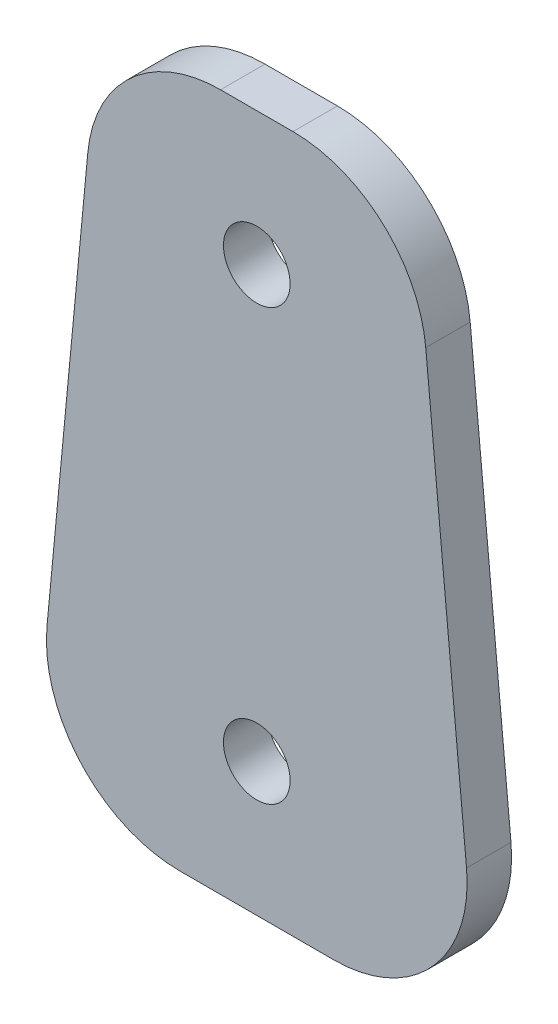
ISO-10303-21;
HEADER;
FILE_DESCRIPTION(('STEP AP214'),'2;1');
FILE_NAME('part.step','',(''),(''),'','','');
FILE_SCHEMA(('AUTOMOTIVE_DESIGN { 1 0 10303 214 1 1 1 1 }'));
ENDSEC;
DATA;
#1=APPLICATION_CONTEXT('core data for automotive mechanical design processes');
#2=APPLICATION_PROTOCOL_DEFINITION('international standard','automotive_design',2000,#1);
#3=PRODUCT_CONTEXT('',#1,'mechanical');
#4=PRODUCT('Part','Part','',(#3));
#5=PRODUCT_RELATED_PRODUCT_CATEGORY('part','',(#4));
#6=PRODUCT_DEFINITION_FORMATION('','',#4);
#7=PRODUCT_DEFINITION_CONTEXT('part definition',#1,'design');
#8=PRODUCT_DEFINITION('design','',#6,#7);
#9=PRODUCT_DEFINITION_SHAPE('','',#8);
#10=(LENGTH_UNIT() NAMED_UNIT(*) SI_UNIT(.MILLI.,.METRE.));
#11=(NAMED_UNIT(*) PLANE_ANGLE_UNIT() SI_UNIT($,.RADIAN.));
#12=(NAMED_UNIT(*) SI_UNIT($,.STERADIAN.) SOLID_ANGLE_UNIT());
#13=UNCERTAINTY_MEASURE_WITH_UNIT(LENGTH_MEASURE(1.E-05),#10,'distance_accuracy_value','');
#14=(GEOMETRIC_REPRESENTATION_CONTEXT(3) GLOBAL_UNCERTAINTY_ASSIGNED_CONTEXT((#13)) GLOBAL_UNIT_ASSIGNED_CONTEXT((#10,
#11,#12)) REPRESENTATION_CONTEXT('',''));
#15=CARTESIAN_POINT('',(0.,0.,0.));
#16=DIRECTION('',(0.,0.,1.));
#17=DIRECTION('',(1.,0.,0.));
#18=AXIS2_PLACEMENT_3D('',#15,#16,#17);
#19=CARTESIAN_POINT('',(21.2254539844644,122.936,3.175));
#20=DIRECTION('',(0.,0.,1.));
#21=DIRECTION('',(1.,0.,0.));
#22=AXIS2_PLACEMENT_3D('',#19,#20,#21);
#23=PLANE('',#22);
#24=CARTESIAN_POINT('',(23.8124999999998,92.202,3.175));
#25=DIRECTION('',(0.,0.,1.));
#26=DIRECTION('',(1.,0.,0.));
#27=AXIS2_PLACEMENT_3D('',#24,#25,#26);
#28=CIRCLE('',#27,2.38125);
#29=CARTESIAN_POINT('',(26.1937499999998,92.202,3.175));
#30=VERTEX_POINT('',#29);
#31=EDGE_CURVE('E134',#30,#30,#28,.T.);
#32=ORIENTED_EDGE('',*,*,#31,.F.);
#33=EDGE_LOOP('',(#32));
#34=FACE_BOUND('',#33,.T.);
#35=CARTESIAN_POINT('',(21.2254539844644,122.936,3.175));
#36=DIRECTION('',(0.,0.,1.));
#37=DIRECTION('',(1.,0.,0.));
#38=AXIS2_PLACEMENT_3D('',#35,#36,#37);
#39=CIRCLE('',#38,9.525);
#40=CARTESIAN_POINT('',(21.2254539844645,132.461,3.175));
#41=VERTEX_POINT('',#40);
#42=CARTESIAN_POINT('',(11.7429929978729,123.835198886659,3.175));
#43=VERTEX_POINT('',#42);
#44=EDGE_CURVE('E145',#41,#43,#39,.T.);
#45=ORIENTED_EDGE('',*,*,#44,.T.);
#46=DIRECTION('',(-0.0944040825889282,-0.995533961846879,0.));
#47=VECTOR('',#46,1.);
#48=CARTESIAN_POINT('',(11.7429929978729,123.835198886659,3.175));
#49=LINE('',#48,#47);
#50=CARTESIAN_POINT('',(8.82856196339013,93.1011988866596,3.175));
#51=VERTEX_POINT('',#50);
#52=EDGE_CURVE('E93',#43,#51,#49,.T.);
#53=ORIENTED_EDGE('',*,*,#52,.T.);
#54=CARTESIAN_POINT('',(18.3110229499816,92.202,3.175));
#55=DIRECTION('',(0.,0.,1.));
#56=DIRECTION('',(-1.,0.,0.));
#57=AXIS2_PLACEMENT_3D('',#54,#55,#56);
#58=CIRCLE('',#57,9.525);
#59=CARTESIAN_POINT('',(18.3110229499817,82.677,3.175));
#60=VERTEX_POINT('',#59);
#61=EDGE_CURVE('E160',#51,#60,#58,.T.);
#62=ORIENTED_EDGE('',*,*,#61,.T.);
#63=DIRECTION('',(1.,0.,0.));
#64=VECTOR('',#63,1.);
#65=CARTESIAN_POINT('',(18.3110229499817,82.677,3.175));
#66=LINE('',#65,#64);
#67=CARTESIAN_POINT('',(29.3139770500183,82.677,3.175));
#68=VERTEX_POINT('',#67);
#69=EDGE_CURVE('E173',#60,#68,#66,.T.);
#70=ORIENTED_EDGE('',*,*,#69,.T.);
#71=CARTESIAN_POINT('',(29.3139770500184,92.202,3.175));
#72=DIRECTION('',(0.,0.,1.));
#73=DIRECTION('',(1.,0.,0.));
#74=AXIS2_PLACEMENT_3D('',#71,#72,#73);
#75=CIRCLE('',#74,9.525);
#76=CARTESIAN_POINT('',(38.7964380366099,93.1011988866596,3.175));
#77=VERTEX_POINT('',#76);
#78=EDGE_CURVE('E112',#68,#77,#75,.T.);
#79=ORIENTED_EDGE('',*,*,#78,.T.);
#80=DIRECTION('',(-0.0944040825889281,0.995533961846879,0.));
#81=VECTOR('',#80,1.);
#82=CARTESIAN_POINT('',(38.7964380366099,93.1011988866596,3.175));
#83=LINE('',#82,#81);
#84=CARTESIAN_POINT('',(35.8820070021271,123.835198886659,3.175));
#85=VERTEX_POINT('',#84);
#86=EDGE_CURVE('E106',#77,#85,#83,.T.);
#87=ORIENTED_EDGE('',*,*,#86,.T.);
#88=CARTESIAN_POINT('',(26.3995460155356,122.936,3.175));
#89=DIRECTION('',(0.,0.,1.));
#90=DIRECTION('',(-1.,0.,0.));
#91=AXIS2_PLACEMENT_3D('',#88,#89,#90);
#92=CIRCLE('',#91,9.525);
#93=CARTESIAN_POINT('',(26.3995460155355,132.461,3.175));
#94=VERTEX_POINT('',#93);
#95=EDGE_CURVE('E110',#85,#94,#92,.T.);
#96=ORIENTED_EDGE('',*,*,#95,.T.);
#97=DIRECTION('',(-1.,0.,0.));
#98=VECTOR('',#97,1.);
#99=CARTESIAN_POINT('',(26.3995460155355,132.461,3.175));
#100=LINE('',#99,#98);
#101=EDGE_CURVE('E50',#94,#41,#100,.T.);
#102=ORIENTED_EDGE('',*,*,#101,.T.);
#103=EDGE_LOOP('',(#45,#53,#62,#70,#79,#87,#96,#102));
#104=FACE_BOUND('',#103,.T.);
#105=CARTESIAN_POINT('',(23.8124999999997,122.936,3.175));
#106=DIRECTION('',(0.,0.,1.));
#107=DIRECTION('',(1.,0.,0.));
#108=AXIS2_PLACEMENT_3D('',#105,#106,#107);
#109=CIRCLE('',#108,2.38125);
#110=CARTESIAN_POINT('',(26.1937499999997,122.936,3.175));
#111=VERTEX_POINT('',#110);
#112=EDGE_CURVE('E182',#111,#111,#109,.T.);
#113=ORIENTED_EDGE('',*,*,#112,.F.);
#114=EDGE_LOOP('',(#113));
#115=FACE_BOUND('',#114,.T.);
#116=ADVANCED_FACE('F33',(#34,#104,#115),#23,.T.);
#117=CARTESIAN_POINT('',(21.2254539844644,122.936,0.));
#118=DIRECTION('',(0.,0.,1.));
#119=DIRECTION('',(1.,0.,0.));
#120=AXIS2_PLACEMENT_3D('',#117,#118,#119);
#121=PLANE('',#120);
#122=CARTESIAN_POINT('',(21.2254539844644,122.936,0.));
#123=DIRECTION('',(0.,0.,1.));
#124=DIRECTION('',(1.,0.,0.));
#125=AXIS2_PLACEMENT_3D('',#122,#123,#124);
#126=CIRCLE('',#125,9.525);
#127=CARTESIAN_POINT('',(21.2254539844645,132.461,0.));
#128=VERTEX_POINT('',#127);
#129=CARTESIAN_POINT('',(11.7429929978729,123.835198886659,0.));
#130=VERTEX_POINT('',#129);
#131=EDGE_CURVE('E130',#128,#130,#126,.T.);
#132=ORIENTED_EDGE('',*,*,#131,.F.);
#133=DIRECTION('',(-1.,0.,0.));
#134=VECTOR('',#133,1.);
#135=CARTESIAN_POINT('',(26.3995460155355,132.461,0.));
#136=LINE('',#135,#134);
#137=CARTESIAN_POINT('',(26.3995460155355,132.461,0.));
#138=VERTEX_POINT('',#137);
#139=EDGE_CURVE('E85',#138,#128,#136,.T.);
#140=ORIENTED_EDGE('',*,*,#139,.F.);
#141=CARTESIAN_POINT('',(26.3995460155356,122.936,0.));
#142=DIRECTION('',(0.,0.,1.));
#143=DIRECTION('',(-1.,0.,0.));
#144=AXIS2_PLACEMENT_3D('',#141,#142,#143);
#145=CIRCLE('',#144,9.525);
#146=CARTESIAN_POINT('',(35.8820070021271,123.835198886659,0.));
#147=VERTEX_POINT('',#146);
#148=EDGE_CURVE('E79',#147,#138,#145,.T.);
#149=ORIENTED_EDGE('',*,*,#148,.F.);
#150=DIRECTION('',(-0.0944040825889281,0.995533961846879,0.));
#151=VECTOR('',#150,1.);
#152=CARTESIAN_POINT('',(38.7964380366099,93.1011988866596,0.));
#153=LINE('',#152,#151);
#154=CARTESIAN_POINT('',(38.7964380366099,93.1011988866596,0.));
#155=VERTEX_POINT('',#154);
#156=EDGE_CURVE('E120',#155,#147,#153,.T.);
#157=ORIENTED_EDGE('',*,*,#156,.F.);
#158=CARTESIAN_POINT('',(29.3139770500184,92.202,0.));
#159=DIRECTION('',(0.,0.,1.));
#160=DIRECTION('',(1.,0.,0.));
#161=AXIS2_PLACEMENT_3D('',#158,#159,#160);
#162=CIRCLE('',#161,9.525);
#163=CARTESIAN_POINT('',(29.3139770500183,82.677,0.));
#164=VERTEX_POINT('',#163);
#165=EDGE_CURVE('E140',#164,#155,#162,.T.);
#166=ORIENTED_EDGE('',*,*,#165,.F.);
#167=DIRECTION('',(1.,0.,0.));
#168=VECTOR('',#167,1.);
#169=CARTESIAN_POINT('',(18.3110229499817,82.677,0.));
#170=LINE('',#169,#168);
#171=CARTESIAN_POINT('',(18.3110229499817,82.677,0.));
#172=VERTEX_POINT('',#171);
#173=EDGE_CURVE('E138',#172,#164,#170,.T.);
#174=ORIENTED_EDGE('',*,*,#173,.F.);
#175=CARTESIAN_POINT('',(18.3110229499816,92.202,0.));
#176=DIRECTION('',(0.,0.,1.));
#177=DIRECTION('',(-1.,0.,0.));
#178=AXIS2_PLACEMENT_3D('',#175,#176,#177);
#179=CIRCLE('',#178,9.525);
#180=CARTESIAN_POINT('',(8.82856196339013,93.1011988866596,0.));
#181=VERTEX_POINT('',#180);
#182=EDGE_CURVE('E136',#181,#172,#179,.T.);
#183=ORIENTED_EDGE('',*,*,#182,.F.);
#184=DIRECTION('',(-0.0944040825889282,-0.995533961846879,0.));
#185=VECTOR('',#184,1.);
#186=CARTESIAN_POINT('',(11.7429929978729,123.835198886659,0.));
#187=LINE('',#186,#185);
#188=EDGE_CURVE('E133',#130,#181,#187,.T.);
#189=ORIENTED_EDGE('',*,*,#188,.F.);
#190=EDGE_LOOP('',(#132,#140,#149,#157,#166,#174,#183,#189));
#191=FACE_BOUND('',#190,.T.);
#192=CARTESIAN_POINT('',(23.8124999999998,92.202,0.));
#193=DIRECTION('',(0.,0.,1.));
#194=DIRECTION('',(1.,0.,0.));
#195=AXIS2_PLACEMENT_3D('',#192,#193,#194);
#196=CIRCLE('',#195,2.38125);
#197=CARTESIAN_POINT('',(26.1937499999998,92.202,0.));
#198=VERTEX_POINT('',#197);
#199=EDGE_CURVE('E179',#198,#198,#196,.T.);
#200=ORIENTED_EDGE('',*,*,#199,.T.);
#201=EDGE_LOOP('',(#200));
#202=FACE_BOUND('',#201,.T.);
#203=CARTESIAN_POINT('',(23.8124999999997,122.936,0.));
#204=DIRECTION('',(0.,0.,1.));
#205=DIRECTION('',(1.,0.,0.));
#206=AXIS2_PLACEMENT_3D('',#203,#204,#205);
#207=CIRCLE('',#206,2.38125);
#208=CARTESIAN_POINT('',(26.1937499999997,122.936,0.));
#209=VERTEX_POINT('',#208);
#210=EDGE_CURVE('E185',#209,#209,#207,.T.);
#211=ORIENTED_EDGE('',*,*,#210,.T.);
#212=EDGE_LOOP('',(#211));
#213=FACE_BOUND('',#212,.T.);
#214=ADVANCED_FACE('F164',(#191,#202,#213),#121,.F.);
#215=CARTESIAN_POINT('',(21.2254539844644,122.936,3.175));
#216=DIRECTION('',(0.,0.,-1.));
#217=DIRECTION('',(-1.,0.,0.));
#218=AXIS2_PLACEMENT_3D('',#215,#216,#217);
#219=CYLINDRICAL_SURFACE('',#218,9.525);
#220=ORIENTED_EDGE('',*,*,#131,.T.);
#221=DIRECTION('',(0.,0.,-1.));
#222=VECTOR('',#221,1.);
#223=CARTESIAN_POINT('',(11.7429929978729,123.835198886659,3.175));
#224=LINE('',#223,#222);
#225=EDGE_CURVE('E11',#43,#130,#224,.T.);
#226=ORIENTED_EDGE('',*,*,#225,.F.);
#227=ORIENTED_EDGE('',*,*,#44,.F.);
#228=DIRECTION('',(0.,0.,-1.));
#229=VECTOR('',#228,1.);
#230=CARTESIAN_POINT('',(21.2254539844645,132.461,3.175));
#231=LINE('',#230,#229);
#232=EDGE_CURVE('E126',#41,#128,#231,.T.);
#233=ORIENTED_EDGE('',*,*,#232,.T.);
#234=EDGE_LOOP('',(#220,#226,#227,#233));
#235=FACE_BOUND('',#234,.T.);
#236=ADVANCED_FACE('F35',(#235),#219,.T.);
#237=CARTESIAN_POINT('',(11.7429929978729,123.835198886659,3.175));
#238=DIRECTION('',(0.995533961846879,-0.0944040825889282,0.));
#239=DIRECTION('',(0.0944040825889282,0.995533961846879,0.));
#240=AXIS2_PLACEMENT_3D('',#237,#238,#239);
#241=PLANE('',#240);
#242=ORIENTED_EDGE('',*,*,#188,.T.);
#243=DIRECTION('',(0.,0.,-1.));
#244=VECTOR('',#243,1.);
#245=CARTESIAN_POINT('',(8.82856196339013,93.1011988866596,3.175));
#246=LINE('',#245,#244);
#247=EDGE_CURVE('E42',#51,#181,#246,.T.);
#248=ORIENTED_EDGE('',*,*,#247,.F.);
#249=ORIENTED_EDGE('',*,*,#52,.F.);
#250=ORIENTED_EDGE('',*,*,#225,.T.);
#251=EDGE_LOOP('',(#242,#248,#249,#250));
#252=FACE_BOUND('',#251,.T.);
#253=ADVANCED_FACE('F217',(#252),#241,.F.);
#254=CARTESIAN_POINT('',(18.3110229499816,92.202,3.175));
#255=DIRECTION('',(0.,0.,-1.));
#256=DIRECTION('',(-1.,0.,0.));
#257=AXIS2_PLACEMENT_3D('',#254,#255,#256);
#258=CYLINDRICAL_SURFACE('',#257,9.525);
#259=ORIENTED_EDGE('',*,*,#182,.T.);
#260=DIRECTION('',(0.,0.,-1.));
#261=VECTOR('',#260,1.);
#262=CARTESIAN_POINT('',(18.3110229499817,82.677,3.175));
#263=LINE('',#262,#261);
#264=EDGE_CURVE('E152',#60,#172,#263,.T.);
#265=ORIENTED_EDGE('',*,*,#264,.F.);
#266=ORIENTED_EDGE('',*,*,#61,.F.);
#267=ORIENTED_EDGE('',*,*,#247,.T.);
#268=EDGE_LOOP('',(#259,#265,#266,#267));
#269=FACE_BOUND('',#268,.T.);
#270=ADVANCED_FACE('F158',(#269),#258,.T.);
#271=CARTESIAN_POINT('',(18.3110229499817,82.677,3.175));
#272=DIRECTION('',(0.,1.,0.));
#273=DIRECTION('',(0.,0.,1.));
#274=AXIS2_PLACEMENT_3D('',#271,#272,#273);
#275=PLANE('',#274);
#276=ORIENTED_EDGE('',*,*,#173,.T.);
#277=DIRECTION('',(0.,0.,-1.));
#278=VECTOR('',#277,1.);
#279=CARTESIAN_POINT('',(29.3139770500183,82.677,3.175));
#280=LINE('',#279,#278);
#281=EDGE_CURVE('E149',#68,#164,#280,.T.);
#282=ORIENTED_EDGE('',*,*,#281,.F.);
#283=ORIENTED_EDGE('',*,*,#69,.F.);
#284=ORIENTED_EDGE('',*,*,#264,.T.);
#285=EDGE_LOOP('',(#276,#282,#283,#284));
#286=FACE_BOUND('',#285,.T.);
#287=ADVANCED_FACE('F169',(#286),#275,.F.);
#288=CARTESIAN_POINT('',(29.3139770500184,92.202,3.175));
#289=DIRECTION('',(0.,0.,-1.));
#290=DIRECTION('',(-1.,0.,0.));
#291=AXIS2_PLACEMENT_3D('',#288,#289,#290);
#292=CYLINDRICAL_SURFACE('',#291,9.525);
#293=ORIENTED_EDGE('',*,*,#165,.T.);
#294=DIRECTION('',(0.,0.,-1.));
#295=VECTOR('',#294,1.);
#296=CARTESIAN_POINT('',(38.7964380366099,93.1011988866596,3.175));
#297=LINE('',#296,#295);
#298=EDGE_CURVE('E121',#77,#155,#297,.T.);
#299=ORIENTED_EDGE('',*,*,#298,.F.);
#300=ORIENTED_EDGE('',*,*,#78,.F.);
#301=ORIENTED_EDGE('',*,*,#281,.T.);
#302=EDGE_LOOP('',(#293,#299,#300,#301));
#303=FACE_BOUND('',#302,.T.);
#304=ADVANCED_FACE('F172',(#303),#292,.T.);
#305=CARTESIAN_POINT('',(38.7964380366099,93.1011988866596,3.175));
#306=DIRECTION('',(-0.995533961846879,-0.0944040825889281,0.));
#307=DIRECTION('',(0.0944040825889281,-0.995533961846879,0.));
#308=AXIS2_PLACEMENT_3D('',#305,#306,#307);
#309=PLANE('',#308);
#310=ORIENTED_EDGE('',*,*,#156,.T.);
#311=DIRECTION('',(0.,0.,-1.));
#312=VECTOR('',#311,1.);
#313=CARTESIAN_POINT('',(35.8820070021271,123.835198886659,3.175));
#314=LINE('',#313,#312);
#315=EDGE_CURVE('E117',#85,#147,#314,.T.);
#316=ORIENTED_EDGE('',*,*,#315,.F.);
#317=ORIENTED_EDGE('',*,*,#86,.F.);
#318=ORIENTED_EDGE('',*,*,#298,.T.);
#319=EDGE_LOOP('',(#310,#316,#317,#318));
#320=FACE_BOUND('',#319,.T.);
#321=ADVANCED_FACE('F118',(#320),#309,.F.);
#322=CARTESIAN_POINT('',(26.3995460155356,122.936,3.175));
#323=DIRECTION('',(0.,0.,-1.));
#324=DIRECTION('',(-1.,0.,0.));
#325=AXIS2_PLACEMENT_3D('',#322,#323,#324);
#326=CYLINDRICAL_SURFACE('',#325,9.525);
#327=ORIENTED_EDGE('',*,*,#148,.T.);
#328=DIRECTION('',(0.,0.,-1.));
#329=VECTOR('',#328,1.);
#330=CARTESIAN_POINT('',(26.3995460155355,132.461,3.175));
#331=LINE('',#330,#329);
#332=EDGE_CURVE('E122',#94,#138,#331,.T.);
#333=ORIENTED_EDGE('',*,*,#332,.F.);
#334=ORIENTED_EDGE('',*,*,#95,.F.);
#335=ORIENTED_EDGE('',*,*,#315,.T.);
#336=EDGE_LOOP('',(#327,#333,#334,#335));
#337=FACE_BOUND('',#336,.T.);
#338=ADVANCED_FACE('F124',(#337),#326,.T.);
#339=CARTESIAN_POINT('',(26.3995460155355,132.461,3.175));
#340=DIRECTION('',(0.,-1.,0.));
#341=DIRECTION('',(0.,0.,-1.));
#342=AXIS2_PLACEMENT_3D('',#339,#340,#341);
#343=PLANE('',#342);
#344=ORIENTED_EDGE('',*,*,#139,.T.);
#345=ORIENTED_EDGE('',*,*,#232,.F.);
#346=ORIENTED_EDGE('',*,*,#101,.F.);
#347=ORIENTED_EDGE('',*,*,#332,.T.);
#348=EDGE_LOOP('',(#344,#345,#346,#347));
#349=FACE_BOUND('',#348,.T.);
#350=ADVANCED_FACE('F205',(#349),#343,.F.);
#351=CARTESIAN_POINT('',(23.8124999999998,92.202,3.175));
#352=DIRECTION('',(0.,0.,-1.));
#353=DIRECTION('',(-1.,0.,0.));
#354=AXIS2_PLACEMENT_3D('',#351,#352,#353);
#355=CYLINDRICAL_SURFACE('',#354,2.38125);
#356=ORIENTED_EDGE('',*,*,#31,.T.);
#357=EDGE_LOOP('',(#356));
#358=FACE_BOUND('',#357,.T.);
#359=ORIENTED_EDGE('',*,*,#199,.F.);
#360=EDGE_LOOP('',(#359));
#361=FACE_BOUND('',#360,.T.);
#362=ADVANCED_FACE('F202',(#358,#361),#355,.F.);
#363=CARTESIAN_POINT('',(23.8124999999997,122.936,3.175));
#364=DIRECTION('',(0.,0.,-1.));
#365=DIRECTION('',(-1.,0.,0.));
#366=AXIS2_PLACEMENT_3D('',#363,#364,#365);
#367=CYLINDRICAL_SURFACE('',#366,2.38125);
#368=ORIENTED_EDGE('',*,*,#112,.T.);
#369=EDGE_LOOP('',(#368));
#370=FACE_BOUND('',#369,.T.);
#371=ORIENTED_EDGE('',*,*,#210,.F.);
#372=EDGE_LOOP('',(#371));
#373=FACE_BOUND('',#372,.T.);
#374=ADVANCED_FACE('F191',(#370,#373),#367,.F.);
#375=CLOSED_SHELL('',(#116,#214,#236,#253,#270,#287,#304,#321,#338,#350,#362,#374));
#376=MANIFOLD_SOLID_BREP('B2',#375);
#377=ADVANCED_BREP_SHAPE_REPRESENTATION('',(#18,#376),#14);
#378=SHAPE_DEFINITION_REPRESENTATION(#9,#377);
ENDSEC;
END-ISO-10303-21;
